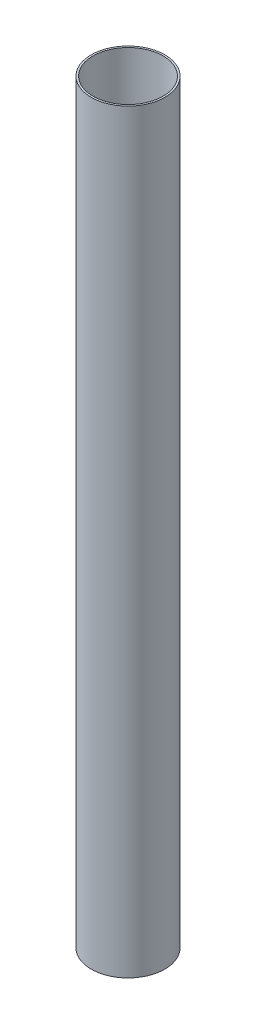
ISO-10303-21;
HEADER;
FILE_DESCRIPTION(('STEP AP214'),'2;1');
FILE_NAME('part.step','',(''),(''),'','','');
FILE_SCHEMA(('AUTOMOTIVE_DESIGN { 1 0 10303 214 1 1 1 1 }'));
ENDSEC;
DATA;
#1=APPLICATION_CONTEXT('core data for automotive mechanical design processes');
#2=APPLICATION_PROTOCOL_DEFINITION('international standard','automotive_design',2000,#1);
#3=PRODUCT_CONTEXT('',#1,'mechanical');
#4=PRODUCT('Part','Part','',(#3));
#5=PRODUCT_RELATED_PRODUCT_CATEGORY('part','',(#4));
#6=PRODUCT_DEFINITION_FORMATION('','',#4);
#7=PRODUCT_DEFINITION_CONTEXT('part definition',#1,'design');
#8=PRODUCT_DEFINITION('design','',#6,#7);
#9=PRODUCT_DEFINITION_SHAPE('','',#8);
#10=(LENGTH_UNIT() NAMED_UNIT(*) SI_UNIT(.MILLI.,.METRE.));
#11=(NAMED_UNIT(*) PLANE_ANGLE_UNIT() SI_UNIT($,.RADIAN.));
#12=(NAMED_UNIT(*) SI_UNIT($,.STERADIAN.) SOLID_ANGLE_UNIT());
#13=UNCERTAINTY_MEASURE_WITH_UNIT(LENGTH_MEASURE(1.E-05),#10,'distance_accuracy_value','');
#14=(GEOMETRIC_REPRESENTATION_CONTEXT(3) GLOBAL_UNCERTAINTY_ASSIGNED_CONTEXT((#13)) GLOBAL_UNIT_ASSIGNED_CONTEXT((#10,
#11,#12)) REPRESENTATION_CONTEXT('',''));
#15=CARTESIAN_POINT('',(0.,0.,0.));
#16=DIRECTION('',(0.,0.,1.));
#17=DIRECTION('',(1.,0.,0.));
#18=AXIS2_PLACEMENT_3D('',#15,#16,#17);
#19=CARTESIAN_POINT('',(0.,820.,0.));
#20=DIRECTION('',(0.,1.,0.));
#21=DIRECTION('',(0.,0.,1.));
#22=AXIS2_PLACEMENT_3D('',#19,#20,#21);
#23=PLANE('',#22);
#24=CARTESIAN_POINT('',(0.,820.,0.));
#25=DIRECTION('',(0.,1.,0.));
#26=DIRECTION('',(0.,0.,1.));
#27=AXIS2_PLACEMENT_3D('',#24,#25,#26);
#28=CIRCLE('',#27,40.);
#29=CARTESIAN_POINT('',(0.,820.,-40.));
#30=VERTEX_POINT('',#29);
#31=EDGE_CURVE('E10',#30,#30,#28,.T.);
#32=ORIENTED_EDGE('',*,*,#31,.T.);
#33=EDGE_LOOP('',(#32));
#34=FACE_BOUND('',#33,.T.);
#35=CARTESIAN_POINT('',(0.,820.,0.));
#36=DIRECTION('',(0.,1.,0.));
#37=DIRECTION('',(0.,0.,1.));
#38=AXIS2_PLACEMENT_3D('',#35,#36,#37);
#39=CIRCLE('',#38,38.);
#40=CARTESIAN_POINT('',(0.,820.,-38.));
#41=VERTEX_POINT('',#40);
#42=EDGE_CURVE('E42',#41,#41,#39,.T.);
#43=ORIENTED_EDGE('',*,*,#42,.F.);
#44=EDGE_LOOP('',(#43));
#45=FACE_BOUND('',#44,.T.);
#46=ADVANCED_FACE('F31',(#34,#45),#23,.T.);
#47=CARTESIAN_POINT('',(0.,0.,0.));
#48=DIRECTION('',(0.,1.,0.));
#49=DIRECTION('',(0.,0.,1.));
#50=AXIS2_PLACEMENT_3D('',#47,#48,#49);
#51=PLANE('',#50);
#52=CARTESIAN_POINT('',(0.,0.,0.));
#53=DIRECTION('',(0.,1.,0.));
#54=DIRECTION('',(0.,0.,1.));
#55=AXIS2_PLACEMENT_3D('',#52,#53,#54);
#56=CIRCLE('',#55,40.);
#57=CARTESIAN_POINT('',(0.,0.,-40.));
#58=VERTEX_POINT('',#57);
#59=EDGE_CURVE('E35',#58,#58,#56,.T.);
#60=ORIENTED_EDGE('',*,*,#59,.F.);
#61=EDGE_LOOP('',(#60));
#62=FACE_BOUND('',#61,.T.);
#63=CARTESIAN_POINT('',(0.,0.,0.));
#64=DIRECTION('',(0.,1.,0.));
#65=DIRECTION('',(0.,0.,1.));
#66=AXIS2_PLACEMENT_3D('',#63,#64,#65);
#67=CIRCLE('',#66,38.);
#68=CARTESIAN_POINT('',(0.,0.,-38.));
#69=VERTEX_POINT('',#68);
#70=EDGE_CURVE('E44',#69,#69,#67,.T.);
#71=ORIENTED_EDGE('',*,*,#70,.T.);
#72=EDGE_LOOP('',(#71));
#73=FACE_BOUND('',#72,.T.);
#74=ADVANCED_FACE('F54',(#62,#73),#51,.F.);
#75=CARTESIAN_POINT('',(0.,820.,0.));
#76=DIRECTION('',(0.,-1.,0.));
#77=DIRECTION('',(0.,0.,-1.));
#78=AXIS2_PLACEMENT_3D('',#75,#76,#77);
#79=CYLINDRICAL_SURFACE('',#78,40.);
#80=CARTESIAN_POINT('',(0.,820.,-40.));
#81=CARTESIAN_POINT('',(0.,811.458333333333,-40.));
#82=CARTESIAN_POINT('',(0.,802.916666666667,-40.));
#83=CARTESIAN_POINT('',(0.,785.833333333333,-40.));
#84=CARTESIAN_POINT('',(0.,777.291666666667,-40.));
#85=CARTESIAN_POINT('',(0.,760.208333333333,-40.));
#86=CARTESIAN_POINT('',(0.,751.666666666667,-40.));
#87=CARTESIAN_POINT('',(0.,734.583333333333,-40.));
#88=CARTESIAN_POINT('',(0.,726.041666666667,-40.));
#89=CARTESIAN_POINT('',(0.,708.958333333333,-40.));
#90=CARTESIAN_POINT('',(0.,700.416666666667,-40.));
#91=CARTESIAN_POINT('',(0.,683.333333333333,-40.));
#92=CARTESIAN_POINT('',(0.,674.791666666667,-40.));
#93=CARTESIAN_POINT('',(0.,657.708333333333,-40.));
#94=CARTESIAN_POINT('',(0.,649.166666666667,-40.));
#95=CARTESIAN_POINT('',(0.,632.083333333333,-40.));
#96=CARTESIAN_POINT('',(0.,623.541666666667,-40.));
#97=CARTESIAN_POINT('',(0.,606.458333333333,-40.));
#98=CARTESIAN_POINT('',(0.,597.916666666667,-40.));
#99=CARTESIAN_POINT('',(0.,580.833333333333,-40.));
#100=CARTESIAN_POINT('',(0.,572.291666666667,-40.));
#101=CARTESIAN_POINT('',(0.,555.208333333333,-40.));
#102=CARTESIAN_POINT('',(0.,546.666666666667,-40.));
#103=CARTESIAN_POINT('',(0.,529.583333333333,-40.));
#104=CARTESIAN_POINT('',(0.,521.041666666667,-40.));
#105=CARTESIAN_POINT('',(0.,503.958333333333,-40.));
#106=CARTESIAN_POINT('',(0.,495.416666666667,-40.));
#107=CARTESIAN_POINT('',(0.,478.333333333333,-40.));
#108=CARTESIAN_POINT('',(0.,469.791666666667,-40.));
#109=CARTESIAN_POINT('',(0.,452.708333333333,-40.));
#110=CARTESIAN_POINT('',(0.,444.166666666667,-40.));
#111=CARTESIAN_POINT('',(0.,427.083333333333,-40.));
#112=CARTESIAN_POINT('',(0.,418.541666666667,-40.));
#113=CARTESIAN_POINT('',(0.,401.458333333333,-40.));
#114=CARTESIAN_POINT('',(0.,392.916666666667,-40.));
#115=CARTESIAN_POINT('',(0.,375.833333333333,-40.));
#116=CARTESIAN_POINT('',(0.,367.291666666667,-40.));
#117=CARTESIAN_POINT('',(0.,350.208333333333,-40.));
#118=CARTESIAN_POINT('',(0.,341.666666666667,-40.));
#119=CARTESIAN_POINT('',(0.,324.583333333333,-40.));
#120=CARTESIAN_POINT('',(0.,316.041666666667,-40.));
#121=CARTESIAN_POINT('',(0.,298.958333333333,-40.));
#122=CARTESIAN_POINT('',(0.,290.416666666667,-40.));
#123=CARTESIAN_POINT('',(0.,273.333333333333,-40.));
#124=CARTESIAN_POINT('',(0.,264.791666666667,-40.));
#125=CARTESIAN_POINT('',(0.,247.708333333333,-40.));
#126=CARTESIAN_POINT('',(0.,239.166666666667,-40.));
#127=CARTESIAN_POINT('',(0.,222.083333333333,-40.));
#128=CARTESIAN_POINT('',(0.,213.541666666667,-40.));
#129=CARTESIAN_POINT('',(0.,196.458333333333,-40.));
#130=CARTESIAN_POINT('',(0.,187.916666666667,-40.));
#131=CARTESIAN_POINT('',(0.,170.833333333333,-40.));
#132=CARTESIAN_POINT('',(0.,162.291666666667,-40.));
#133=CARTESIAN_POINT('',(0.,145.208333333333,-40.));
#134=CARTESIAN_POINT('',(0.,136.666666666667,-40.));
#135=CARTESIAN_POINT('',(0.,119.583333333333,-40.));
#136=CARTESIAN_POINT('',(0.,111.041666666667,-40.));
#137=CARTESIAN_POINT('',(0.,93.9583333333334,-40.));
#138=CARTESIAN_POINT('',(0.,85.4166666666667,-40.));
#139=CARTESIAN_POINT('',(0.,68.3333333333334,-40.));
#140=CARTESIAN_POINT('',(0.,59.7916666666667,-40.));
#141=CARTESIAN_POINT('',(0.,42.7083333333333,-40.));
#142=CARTESIAN_POINT('',(0.,34.1666666666667,-40.));
#143=CARTESIAN_POINT('',(0.,17.0833333333333,-40.));
#144=CARTESIAN_POINT('',(0.,8.54166666666666,-40.));
#145=CARTESIAN_POINT('',(0.,0.,-40.));
#146=B_SPLINE_CURVE_WITH_KNOTS('',3,(#80,#81,#82,#83,#84,#85,#86,#87,#88,#89,#90,#91,#92,#93,
#94,#95,#96,#97,#98,#99,#100,#101,#102,#103,#104,#105,#106,#107,#108,#109,#110,#111,#112,#113,
#114,#115,#116,#117,#118,#119,#120,#121,#122,#123,#124,#125,#126,#127,#128,#129,#130,#131,#132,
#133,#134,#135,#136,#137,#138,#139,#140,#141,#142,#143,#144,#145),.UNSPECIFIED.,.F.,.F.,(4,2,2,
2,2,2,2,2,2,2,2,2,2,2,2,2,2,2,2,2,2,2,2,2,2,2,2,2,2,2,2,2,4),(0.,25.6249999999999,
51.2499999999999,76.8749999999999,102.5,128.125,153.75,179.375,205.,230.625,256.25,281.875,
307.5,333.125,358.75,384.375,410.,435.625,461.25,486.875,512.5,538.125,563.75,589.375,615.,
640.625,666.25,691.875,717.5,743.125,768.75,794.375,820.),.UNSPECIFIED.);
#147=EDGE_CURVE('BSEAM33',#30,#58,#146,.T.);
#148=ORIENTED_EDGE('',*,*,#31,.F.);
#149=ORIENTED_EDGE('',*,*,#59,.T.);
#150=ORIENTED_EDGE('',*,*,#147,.T.);
#151=ORIENTED_EDGE('',*,*,#147,.F.);
#152=EDGE_LOOP('',(#148,#150,#149,#151));
#153=FACE_BOUND('',#152,.T.);
#154=ADVANCED_FACE('F33',(#153),#79,.T.);
#155=CARTESIAN_POINT('',(0.,820.,0.));
#156=DIRECTION('',(0.,-1.,0.));
#157=DIRECTION('',(0.,0.,-1.));
#158=AXIS2_PLACEMENT_3D('',#155,#156,#157);
#159=CYLINDRICAL_SURFACE('',#158,38.);
#160=CARTESIAN_POINT('',(0.,820.,-38.));
#161=CARTESIAN_POINT('',(0.,811.458333333333,-38.));
#162=CARTESIAN_POINT('',(0.,802.916666666667,-38.));
#163=CARTESIAN_POINT('',(0.,785.833333333333,-38.));
#164=CARTESIAN_POINT('',(0.,777.291666666667,-38.));
#165=CARTESIAN_POINT('',(0.,760.208333333333,-38.));
#166=CARTESIAN_POINT('',(0.,751.666666666667,-38.));
#167=CARTESIAN_POINT('',(0.,734.583333333333,-38.));
#168=CARTESIAN_POINT('',(0.,726.041666666667,-38.));
#169=CARTESIAN_POINT('',(0.,708.958333333333,-38.));
#170=CARTESIAN_POINT('',(0.,700.416666666667,-38.));
#171=CARTESIAN_POINT('',(0.,683.333333333333,-38.));
#172=CARTESIAN_POINT('',(0.,674.791666666667,-38.));
#173=CARTESIAN_POINT('',(0.,657.708333333333,-38.));
#174=CARTESIAN_POINT('',(0.,649.166666666667,-38.));
#175=CARTESIAN_POINT('',(0.,632.083333333333,-38.));
#176=CARTESIAN_POINT('',(0.,623.541666666667,-38.));
#177=CARTESIAN_POINT('',(0.,606.458333333333,-38.));
#178=CARTESIAN_POINT('',(0.,597.916666666667,-38.));
#179=CARTESIAN_POINT('',(0.,580.833333333333,-38.));
#180=CARTESIAN_POINT('',(0.,572.291666666667,-38.));
#181=CARTESIAN_POINT('',(0.,555.208333333333,-38.));
#182=CARTESIAN_POINT('',(0.,546.666666666667,-38.));
#183=CARTESIAN_POINT('',(0.,529.583333333333,-38.));
#184=CARTESIAN_POINT('',(0.,521.041666666667,-38.));
#185=CARTESIAN_POINT('',(0.,503.958333333333,-38.));
#186=CARTESIAN_POINT('',(0.,495.416666666667,-38.));
#187=CARTESIAN_POINT('',(0.,478.333333333333,-38.));
#188=CARTESIAN_POINT('',(0.,469.791666666667,-38.));
#189=CARTESIAN_POINT('',(0.,452.708333333333,-38.));
#190=CARTESIAN_POINT('',(0.,444.166666666667,-38.));
#191=CARTESIAN_POINT('',(0.,427.083333333333,-38.));
#192=CARTESIAN_POINT('',(0.,418.541666666667,-38.));
#193=CARTESIAN_POINT('',(0.,401.458333333333,-38.));
#194=CARTESIAN_POINT('',(0.,392.916666666667,-38.));
#195=CARTESIAN_POINT('',(0.,375.833333333333,-38.));
#196=CARTESIAN_POINT('',(0.,367.291666666667,-38.));
#197=CARTESIAN_POINT('',(0.,350.208333333333,-38.));
#198=CARTESIAN_POINT('',(0.,341.666666666667,-38.));
#199=CARTESIAN_POINT('',(0.,324.583333333333,-38.));
#200=CARTESIAN_POINT('',(0.,316.041666666667,-38.));
#201=CARTESIAN_POINT('',(0.,298.958333333333,-38.));
#202=CARTESIAN_POINT('',(0.,290.416666666667,-38.));
#203=CARTESIAN_POINT('',(0.,273.333333333333,-38.));
#204=CARTESIAN_POINT('',(0.,264.791666666667,-38.));
#205=CARTESIAN_POINT('',(0.,247.708333333333,-38.));
#206=CARTESIAN_POINT('',(0.,239.166666666667,-38.));
#207=CARTESIAN_POINT('',(0.,222.083333333333,-38.));
#208=CARTESIAN_POINT('',(0.,213.541666666667,-38.));
#209=CARTESIAN_POINT('',(0.,196.458333333333,-38.));
#210=CARTESIAN_POINT('',(0.,187.916666666667,-38.));
#211=CARTESIAN_POINT('',(0.,170.833333333333,-38.));
#212=CARTESIAN_POINT('',(0.,162.291666666667,-38.));
#213=CARTESIAN_POINT('',(0.,145.208333333333,-38.));
#214=CARTESIAN_POINT('',(0.,136.666666666667,-38.));
#215=CARTESIAN_POINT('',(0.,119.583333333333,-38.));
#216=CARTESIAN_POINT('',(0.,111.041666666667,-38.));
#217=CARTESIAN_POINT('',(0.,93.9583333333334,-38.));
#218=CARTESIAN_POINT('',(0.,85.4166666666667,-38.));
#219=CARTESIAN_POINT('',(0.,68.3333333333334,-38.));
#220=CARTESIAN_POINT('',(0.,59.7916666666667,-38.));
#221=CARTESIAN_POINT('',(0.,42.7083333333333,-38.));
#222=CARTESIAN_POINT('',(0.,34.1666666666667,-38.));
#223=CARTESIAN_POINT('',(0.,17.0833333333333,-38.));
#224=CARTESIAN_POINT('',(0.,8.54166666666666,-38.));
#225=CARTESIAN_POINT('',(0.,0.,-38.));
#226=B_SPLINE_CURVE_WITH_KNOTS('',3,(#160,#161,#162,#163,#164,#165,#166,#167,#168,#169,#170,
#171,#172,#173,#174,#175,#176,#177,#178,#179,#180,#181,#182,#183,#184,#185,#186,#187,#188,#189,
#190,#191,#192,#193,#194,#195,#196,#197,#198,#199,#200,#201,#202,#203,#204,#205,#206,#207,#208,
#209,#210,#211,#212,#213,#214,#215,#216,#217,#218,#219,#220,#221,#222,#223,#224,#225),
.UNSPECIFIED.,.F.,.F.,(4,2,2,2,2,2,2,2,2,2,2,2,2,2,2,2,2,2,2,2,2,2,2,2,2,2,2,2,2,2,2,2,4),(0.,
25.625,51.25,76.875,102.5,128.125,153.75,179.375,205.,230.625,256.25,281.875,307.5,333.125,
358.75,384.375,410.,435.625,461.25,486.875,512.5,538.125,563.75,589.375,615.,640.625,666.25,
691.875,717.5,743.125,768.75,794.375,820.),.UNSPECIFIED.);
#227=EDGE_CURVE('BSEAM50',#41,#69,#226,.T.);
#228=ORIENTED_EDGE('',*,*,#42,.T.);
#229=ORIENTED_EDGE('',*,*,#70,.F.);
#230=ORIENTED_EDGE('',*,*,#227,.T.);
#231=ORIENTED_EDGE('',*,*,#227,.F.);
#232=EDGE_LOOP('',(#228,#230,#229,#231));
#233=FACE_BOUND('',#232,.T.);
#234=ADVANCED_FACE('F50',(#233),#159,.F.);
#235=CLOSED_SHELL('',(#46,#74,#154,#234));
#236=MANIFOLD_SOLID_BREP('B2',#235);
#237=ADVANCED_BREP_SHAPE_REPRESENTATION('',(#18,#236),#14);
#238=SHAPE_DEFINITION_REPRESENTATION(#9,#237);
ENDSEC;
END-ISO-10303-21;
